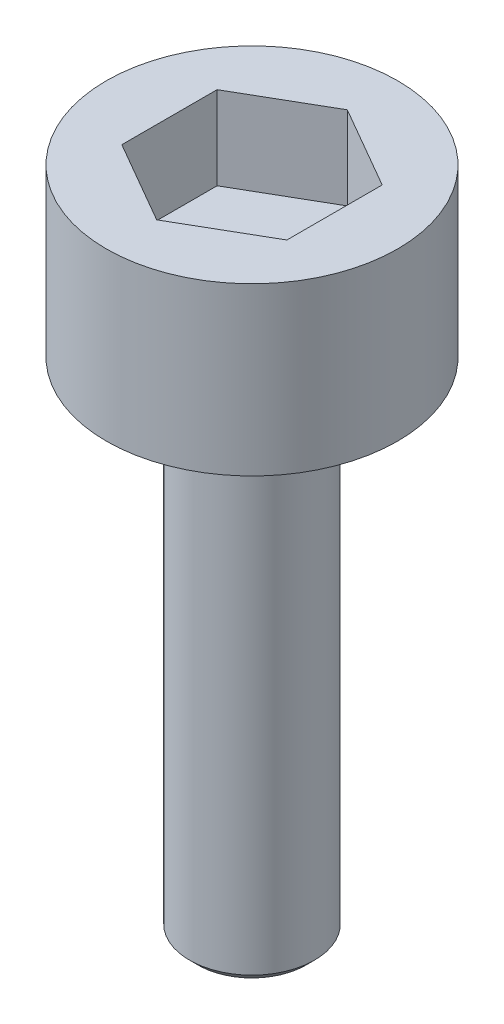
ISO-10303-21;
HEADER;
FILE_DESCRIPTION(('STEP AP214'),'2;1');
FILE_NAME('part.step','',(''),(''),'','','');
FILE_SCHEMA(('AUTOMOTIVE_DESIGN { 1 0 10303 214 1 1 1 1 }'));
ENDSEC;
DATA;
#1=APPLICATION_CONTEXT('core data for automotive mechanical design processes');
#2=APPLICATION_PROTOCOL_DEFINITION('international standard','automotive_design',2000,#1);
#3=PRODUCT_CONTEXT('',#1,'mechanical');
#4=PRODUCT('Part','Part','',(#3));
#5=PRODUCT_RELATED_PRODUCT_CATEGORY('part','',(#4));
#6=PRODUCT_DEFINITION_FORMATION('','',#4);
#7=PRODUCT_DEFINITION_CONTEXT('part definition',#1,'design');
#8=PRODUCT_DEFINITION('design','',#6,#7);
#9=PRODUCT_DEFINITION_SHAPE('','',#8);
#10=(LENGTH_UNIT() NAMED_UNIT(*) SI_UNIT(.MILLI.,.METRE.));
#11=(NAMED_UNIT(*) PLANE_ANGLE_UNIT() SI_UNIT($,.RADIAN.));
#12=(NAMED_UNIT(*) SI_UNIT($,.STERADIAN.) SOLID_ANGLE_UNIT());
#13=UNCERTAINTY_MEASURE_WITH_UNIT(LENGTH_MEASURE(1.E-05),#10,'distance_accuracy_value','');
#14=(GEOMETRIC_REPRESENTATION_CONTEXT(3) GLOBAL_UNCERTAINTY_ASSIGNED_CONTEXT((#13)) GLOBAL_UNIT_ASSIGNED_CONTEXT((#10,
#11,#12)) REPRESENTATION_CONTEXT('',''));
#15=CARTESIAN_POINT('',(0.,0.,0.));
#16=DIRECTION('',(0.,0.,1.));
#17=DIRECTION('',(1.,0.,0.));
#18=AXIS2_PLACEMENT_3D('',#15,#16,#17);
#19=CARTESIAN_POINT('',(0.,4.,0.));
#20=DIRECTION('',(0.,-1.,0.));
#21=DIRECTION('',(0.,0.,-1.));
#22=AXIS2_PLACEMENT_3D('',#19,#20,#21);
#23=CYLINDRICAL_SURFACE('',#22,3.5);
#24=CARTESIAN_POINT('',(0.,4.,0.));
#25=DIRECTION('',(0.,1.,0.));
#26=DIRECTION('',(0.,0.,1.));
#27=AXIS2_PLACEMENT_3D('',#24,#25,#26);
#28=CIRCLE('',#27,3.5);
#29=CARTESIAN_POINT('',(0.,4.,3.5));
#30=VERTEX_POINT('',#29);
#31=EDGE_CURVE('E151',#30,#30,#28,.T.);
#32=ORIENTED_EDGE('',*,*,#31,.F.);
#33=EDGE_LOOP('',(#32));
#34=FACE_BOUND('',#33,.T.);
#35=CARTESIAN_POINT('',(0.,0.,0.));
#36=DIRECTION('',(0.,1.,0.));
#37=DIRECTION('',(0.,0.,1.));
#38=AXIS2_PLACEMENT_3D('',#35,#36,#37);
#39=CIRCLE('',#38,3.5);
#40=CARTESIAN_POINT('',(0.,0.,3.5));
#41=VERTEX_POINT('',#40);
#42=EDGE_CURVE('E142',#41,#41,#39,.T.);
#43=ORIENTED_EDGE('',*,*,#42,.T.);
#44=EDGE_LOOP('',(#43));
#45=FACE_BOUND('',#44,.T.);
#46=ADVANCED_FACE('F39',(#34,#45),#23,.T.);
#47=CARTESIAN_POINT('',(0.,4.,0.));
#48=DIRECTION('',(0.,1.,0.));
#49=DIRECTION('',(0.,0.,1.));
#50=AXIS2_PLACEMENT_3D('',#47,#48,#49);
#51=PLANE('',#50);
#52=DIRECTION('',(-0.866025403784441,0.,-0.499999999999995));
#53=VECTOR('',#52,1.);
#54=CARTESIAN_POINT('',(1.98292704215778,4.,-1.14484346157321));
#55=LINE('',#54,#53);
#56=CARTESIAN_POINT('',(1.98292704215778,4.,-1.14484346157321));
#57=VERTEX_POINT('',#56);
#58=CARTESIAN_POINT('',(0.,4.,-2.28968692314638));
#59=VERTEX_POINT('',#58);
#60=EDGE_CURVE('E55',#57,#59,#55,.T.);
#61=ORIENTED_EDGE('',*,*,#60,.F.);
#62=DIRECTION('',(0.,0.,-1.));
#63=VECTOR('',#62,1.);
#64=CARTESIAN_POINT('',(1.98292704215781,4.,1.14484346157317));
#65=LINE('',#64,#63);
#66=CARTESIAN_POINT('',(1.98292704215781,4.,1.14484346157317));
#67=VERTEX_POINT('',#66);
#68=EDGE_CURVE('E138',#67,#57,#65,.T.);
#69=ORIENTED_EDGE('',*,*,#68,.F.);
#70=DIRECTION('',(0.866025403784435,0.,-0.500000000000007));
#71=VECTOR('',#70,1.);
#72=CARTESIAN_POINT('',(0.,4.,2.28968692314638));
#73=LINE('',#72,#71);
#74=CARTESIAN_POINT('',(0.,4.,2.28968692314638));
#75=VERTEX_POINT('',#74);
#76=EDGE_CURVE('E136',#75,#67,#73,.T.);
#77=ORIENTED_EDGE('',*,*,#76,.F.);
#78=DIRECTION('',(0.866025403784441,0.,0.499999999999995));
#79=VECTOR('',#78,1.);
#80=CARTESIAN_POINT('',(-1.98292704215779,4.,1.1448434615732));
#81=LINE('',#80,#79);
#82=CARTESIAN_POINT('',(-1.98292704215779,4.,1.1448434615732));
#83=VERTEX_POINT('',#82);
#84=EDGE_CURVE('E103',#83,#75,#81,.T.);
#85=ORIENTED_EDGE('',*,*,#84,.F.);
#86=DIRECTION('',(0.,0.,1.));
#87=VECTOR('',#86,1.);
#88=CARTESIAN_POINT('',(-1.9829270421578,4.,-1.14484346157319));
#89=LINE('',#88,#87);
#90=CARTESIAN_POINT('',(-1.9829270421578,4.,-1.14484346157319));
#91=VERTEX_POINT('',#90);
#92=EDGE_CURVE('E132',#91,#83,#89,.T.);
#93=ORIENTED_EDGE('',*,*,#92,.F.);
#94=DIRECTION('',(-0.866025403784438,0.,0.500000000000001));
#95=VECTOR('',#94,1.);
#96=CARTESIAN_POINT('',(0.,4.,-2.28968692314638));
#97=LINE('',#96,#95);
#98=EDGE_CURVE('E129',#59,#91,#97,.T.);
#99=ORIENTED_EDGE('',*,*,#98,.F.);
#100=EDGE_LOOP('',(#61,#69,#77,#85,#93,#99));
#101=FACE_BOUND('',#100,.T.);
#102=ORIENTED_EDGE('',*,*,#31,.T.);
#103=EDGE_LOOP('',(#102));
#104=FACE_BOUND('',#103,.T.);
#105=ADVANCED_FACE('F173',(#101,#104),#51,.T.);
#106=CARTESIAN_POINT('',(0.,0.,0.));
#107=DIRECTION('',(0.,1.,0.));
#108=DIRECTION('',(0.,0.,1.));
#109=AXIS2_PLACEMENT_3D('',#106,#107,#108);
#110=PLANE('',#109);
#111=CARTESIAN_POINT('',(0.,0.,0.));
#112=DIRECTION('',(0.,-1.,0.));
#113=DIRECTION('',(0.,0.,-1.));
#114=AXIS2_PLACEMENT_3D('',#111,#112,#113);
#115=CIRCLE('',#114,1.5);
#116=CARTESIAN_POINT('',(0.,0.,-1.5));
#117=VERTEX_POINT('',#116);
#118=EDGE_CURVE('E148',#117,#117,#115,.T.);
#119=ORIENTED_EDGE('',*,*,#118,.F.);
#120=EDGE_LOOP('',(#119));
#121=FACE_BOUND('',#120,.T.);
#122=ORIENTED_EDGE('',*,*,#42,.F.);
#123=EDGE_LOOP('',(#122));
#124=FACE_BOUND('',#123,.T.);
#125=ADVANCED_FACE('F178',(#121,#124),#110,.F.);
#126=CARTESIAN_POINT('',(0.,-12.,0.));
#127=DIRECTION('',(0.,1.,0.));
#128=DIRECTION('',(0.,0.,1.));
#129=AXIS2_PLACEMENT_3D('',#126,#127,#128);
#130=CYLINDRICAL_SURFACE('',#129,1.5);
#131=CARTESIAN_POINT('',(0.,-11.8,0.));
#132=DIRECTION('',(0.,-1.,0.));
#133=DIRECTION('',(0.,0.,-1.));
#134=AXIS2_PLACEMENT_3D('',#131,#132,#133);
#135=CIRCLE('',#134,1.5);
#136=CARTESIAN_POINT('',(0.,-11.8,-1.5));
#137=VERTEX_POINT('',#136);
#138=EDGE_CURVE('E11',#137,#137,#135,.F.);
#139=ORIENTED_EDGE('',*,*,#138,.T.);
#140=EDGE_LOOP('',(#139));
#141=FACE_BOUND('',#140,.T.);
#142=ORIENTED_EDGE('',*,*,#118,.T.);
#143=EDGE_LOOP('',(#142));
#144=FACE_BOUND('',#143,.T.);
#145=ADVANCED_FACE('F169',(#141,#144),#130,.T.);
#146=CARTESIAN_POINT('',(0.,-12.,0.));
#147=DIRECTION('',(0.,-1.,0.));
#148=DIRECTION('',(0.,0.,-1.));
#149=AXIS2_PLACEMENT_3D('',#146,#147,#148);
#150=PLANE('',#149);
#151=CARTESIAN_POINT('',(0.,-12.,0.));
#152=DIRECTION('',(0.,-1.,0.));
#153=DIRECTION('',(0.,0.,-1.));
#154=AXIS2_PLACEMENT_3D('',#151,#152,#153);
#155=CIRCLE('',#154,1.3);
#156=CARTESIAN_POINT('',(0.,-12.,-1.3));
#157=VERTEX_POINT('',#156);
#158=EDGE_CURVE('E48',#157,#157,#155,.T.);
#159=ORIENTED_EDGE('',*,*,#158,.T.);
#160=EDGE_LOOP('',(#159));
#161=FACE_BOUND('',#160,.T.);
#162=ADVANCED_FACE('F158',(#161),#150,.T.);
#163=CARTESIAN_POINT('',(0.,-12.,0.));
#164=DIRECTION('',(0.,1.,0.));
#165=DIRECTION('',(0.,0.,1.));
#166=AXIS2_PLACEMENT_3D('',#163,#164,#165);
#167=CONICAL_SURFACE('',#166,1.3,0.785398163397446);
#168=ORIENTED_EDGE('',*,*,#138,.F.);
#169=EDGE_LOOP('',(#168));
#170=FACE_BOUND('',#169,.T.);
#171=ORIENTED_EDGE('',*,*,#158,.F.);
#172=EDGE_LOOP('',(#171));
#173=FACE_BOUND('',#172,.T.);
#174=ADVANCED_FACE('F42',(#170,#173),#167,.T.);
#175=CARTESIAN_POINT('',(1.98292704215778,2.,-1.14484346157321));
#176=DIRECTION('',(0.499999999999995,0.,-0.866025403784441));
#177=DIRECTION('',(-0.866025403784442,0.,-0.499999999999995));
#178=AXIS2_PLACEMENT_3D('',#175,#176,#177);
#179=PLANE('',#178);
#180=ORIENTED_EDGE('',*,*,#60,.T.);
#181=DIRECTION('',(0.,1.,0.));
#182=VECTOR('',#181,1.);
#183=CARTESIAN_POINT('',(0.,2.,-2.28968692314638));
#184=LINE('',#183,#182);
#185=CARTESIAN_POINT('',(0.,2.,-2.28968692314638));
#186=VERTEX_POINT('',#185);
#187=EDGE_CURVE('E85',#186,#59,#184,.T.);
#188=ORIENTED_EDGE('',*,*,#187,.F.);
#189=DIRECTION('',(-0.866025403784441,0.,-0.499999999999995));
#190=VECTOR('',#189,1.);
#191=CARTESIAN_POINT('',(1.98292704215778,2.,-1.14484346157321));
#192=LINE('',#191,#190);
#193=CARTESIAN_POINT('',(1.98292704215778,2.,-1.14484346157321));
#194=VERTEX_POINT('',#193);
#195=EDGE_CURVE('E140',#194,#186,#192,.T.);
#196=ORIENTED_EDGE('',*,*,#195,.F.);
#197=DIRECTION('',(0.,1.,0.));
#198=VECTOR('',#197,1.);
#199=CARTESIAN_POINT('',(1.98292704215778,2.,-1.14484346157321));
#200=LINE('',#199,#198);
#201=EDGE_CURVE('E63',#194,#57,#200,.T.);
#202=ORIENTED_EDGE('',*,*,#201,.T.);
#203=EDGE_LOOP('',(#180,#188,#196,#202));
#204=FACE_BOUND('',#203,.T.);
#205=ADVANCED_FACE('F161',(#204),#179,.F.);
#206=CARTESIAN_POINT('',(1.98292704215781,2.,1.14484346157317));
#207=DIRECTION('',(1.,0.,0.));
#208=DIRECTION('',(0.,0.,-1.));
#209=AXIS2_PLACEMENT_3D('',#206,#207,#208);
#210=PLANE('',#209);
#211=ORIENTED_EDGE('',*,*,#68,.T.);
#212=ORIENTED_EDGE('',*,*,#201,.F.);
#213=DIRECTION('',(0.,0.,-1.));
#214=VECTOR('',#213,1.);
#215=CARTESIAN_POINT('',(1.98292704215781,2.,1.14484346157317));
#216=LINE('',#215,#214);
#217=CARTESIAN_POINT('',(1.98292704215781,2.,1.14484346157317));
#218=VERTEX_POINT('',#217);
#219=EDGE_CURVE('E115',#218,#194,#216,.T.);
#220=ORIENTED_EDGE('',*,*,#219,.F.);
#221=DIRECTION('',(0.,1.,0.));
#222=VECTOR('',#221,1.);
#223=CARTESIAN_POINT('',(1.98292704215781,2.,1.14484346157317));
#224=LINE('',#223,#222);
#225=EDGE_CURVE('E107',#218,#67,#224,.T.);
#226=ORIENTED_EDGE('',*,*,#225,.T.);
#227=EDGE_LOOP('',(#211,#212,#220,#226));
#228=FACE_BOUND('',#227,.T.);
#229=ADVANCED_FACE('F167',(#228),#210,.F.);
#230=CARTESIAN_POINT('',(0.,2.,2.28968692314638));
#231=DIRECTION('',(0.500000000000007,0.,0.866025403784435));
#232=DIRECTION('',(0.866025403784435,0.,-0.500000000000007));
#233=AXIS2_PLACEMENT_3D('',#230,#231,#232);
#234=PLANE('',#233);
#235=ORIENTED_EDGE('',*,*,#76,.T.);
#236=ORIENTED_EDGE('',*,*,#225,.F.);
#237=DIRECTION('',(0.866025403784435,0.,-0.500000000000007));
#238=VECTOR('',#237,1.);
#239=CARTESIAN_POINT('',(0.,2.,2.28968692314638));
#240=LINE('',#239,#238);
#241=CARTESIAN_POINT('',(0.,2.,2.28968692314638));
#242=VERTEX_POINT('',#241);
#243=EDGE_CURVE('E111',#242,#218,#240,.T.);
#244=ORIENTED_EDGE('',*,*,#243,.F.);
#245=DIRECTION('',(0.,1.,0.));
#246=VECTOR('',#245,1.);
#247=CARTESIAN_POINT('',(0.,2.,2.28968692314638));
#248=LINE('',#247,#246);
#249=EDGE_CURVE('E96',#242,#75,#248,.T.);
#250=ORIENTED_EDGE('',*,*,#249,.T.);
#251=EDGE_LOOP('',(#235,#236,#244,#250));
#252=FACE_BOUND('',#251,.T.);
#253=ADVANCED_FACE('F112',(#252),#234,.F.);
#254=CARTESIAN_POINT('',(-1.98292704215779,2.,1.1448434615732));
#255=DIRECTION('',(-0.499999999999995,0.,0.866025403784442));
#256=DIRECTION('',(0.866025403784442,0.,0.499999999999995));
#257=AXIS2_PLACEMENT_3D('',#254,#255,#256);
#258=PLANE('',#257);
#259=ORIENTED_EDGE('',*,*,#84,.T.);
#260=ORIENTED_EDGE('',*,*,#249,.F.);
#261=DIRECTION('',(0.866025403784441,0.,0.499999999999995));
#262=VECTOR('',#261,1.);
#263=CARTESIAN_POINT('',(-1.98292704215779,2.,1.1448434615732));
#264=LINE('',#263,#262);
#265=CARTESIAN_POINT('',(-1.98292704215779,2.,1.1448434615732));
#266=VERTEX_POINT('',#265);
#267=EDGE_CURVE('E100',#266,#242,#264,.T.);
#268=ORIENTED_EDGE('',*,*,#267,.F.);
#269=DIRECTION('',(0.,1.,0.));
#270=VECTOR('',#269,1.);
#271=CARTESIAN_POINT('',(-1.98292704215779,2.,1.1448434615732));
#272=LINE('',#271,#270);
#273=EDGE_CURVE('E108',#266,#83,#272,.T.);
#274=ORIENTED_EDGE('',*,*,#273,.T.);
#275=EDGE_LOOP('',(#259,#260,#268,#274));
#276=FACE_BOUND('',#275,.T.);
#277=ADVANCED_FACE('F98',(#276),#258,.F.);
#278=CARTESIAN_POINT('',(-1.9829270421578,2.,-1.14484346157319));
#279=DIRECTION('',(-1.,0.,0.));
#280=DIRECTION('',(0.,0.,1.));
#281=AXIS2_PLACEMENT_3D('',#278,#279,#280);
#282=PLANE('',#281);
#283=ORIENTED_EDGE('',*,*,#92,.T.);
#284=ORIENTED_EDGE('',*,*,#273,.F.);
#285=DIRECTION('',(0.,0.,1.));
#286=VECTOR('',#285,1.);
#287=CARTESIAN_POINT('',(-1.9829270421578,2.,-1.14484346157319));
#288=LINE('',#287,#286);
#289=CARTESIAN_POINT('',(-1.9829270421578,2.,-1.14484346157319));
#290=VERTEX_POINT('',#289);
#291=EDGE_CURVE('E121',#290,#266,#288,.T.);
#292=ORIENTED_EDGE('',*,*,#291,.F.);
#293=DIRECTION('',(0.,1.,0.));
#294=VECTOR('',#293,1.);
#295=CARTESIAN_POINT('',(-1.9829270421578,2.,-1.14484346157319));
#296=LINE('',#295,#294);
#297=EDGE_CURVE('E145',#290,#91,#296,.T.);
#298=ORIENTED_EDGE('',*,*,#297,.T.);
#299=EDGE_LOOP('',(#283,#284,#292,#298));
#300=FACE_BOUND('',#299,.T.);
#301=ADVANCED_FACE('F193',(#300),#282,.F.);
#302=CARTESIAN_POINT('',(0.,2.,-2.28968692314638));
#303=DIRECTION('',(-0.500000000000001,0.,-0.866025403784438));
#304=DIRECTION('',(-0.866025403784438,0.,0.500000000000001));
#305=AXIS2_PLACEMENT_3D('',#302,#303,#304);
#306=PLANE('',#305);
#307=ORIENTED_EDGE('',*,*,#98,.T.);
#308=ORIENTED_EDGE('',*,*,#297,.F.);
#309=DIRECTION('',(-0.866025403784438,0.,0.500000000000001));
#310=VECTOR('',#309,1.);
#311=CARTESIAN_POINT('',(0.,2.,-2.28968692314638));
#312=LINE('',#311,#310);
#313=EDGE_CURVE('E123',#186,#290,#312,.T.);
#314=ORIENTED_EDGE('',*,*,#313,.F.);
#315=ORIENTED_EDGE('',*,*,#187,.T.);
#316=EDGE_LOOP('',(#307,#308,#314,#315));
#317=FACE_BOUND('',#316,.T.);
#318=ADVANCED_FACE('F190',(#317),#306,.F.);
#319=CARTESIAN_POINT('',(0.,2.,0.));
#320=DIRECTION('',(0.,1.,0.));
#321=DIRECTION('',(0.,0.,1.));
#322=AXIS2_PLACEMENT_3D('',#319,#320,#321);
#323=PLANE('',#322);
#324=ORIENTED_EDGE('',*,*,#195,.T.);
#325=ORIENTED_EDGE('',*,*,#313,.T.);
#326=ORIENTED_EDGE('',*,*,#291,.T.);
#327=ORIENTED_EDGE('',*,*,#267,.T.);
#328=ORIENTED_EDGE('',*,*,#243,.T.);
#329=ORIENTED_EDGE('',*,*,#219,.T.);
#330=EDGE_LOOP('',(#324,#325,#326,#327,#328,#329));
#331=FACE_BOUND('',#330,.T.);
#332=ADVANCED_FACE('F118',(#331),#323,.T.);
#333=CLOSED_SHELL('',(#46,#105,#125,#145,#162,#174,#205,#229,#253,#277,#301,#318,#332));
#334=MANIFOLD_SOLID_BREP('B2',#333);
#335=ADVANCED_BREP_SHAPE_REPRESENTATION('',(#18,#334),#14);
#336=SHAPE_DEFINITION_REPRESENTATION(#9,#335);
ENDSEC;
END-ISO-10303-21;
